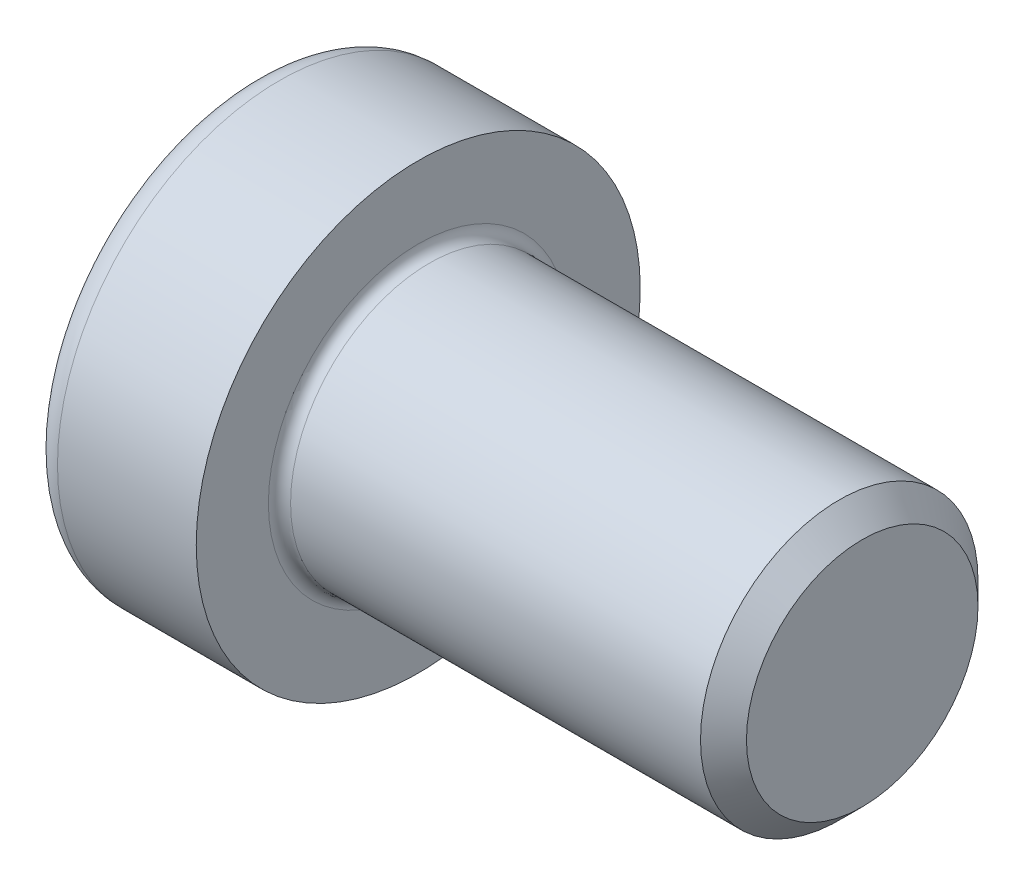
ISO-10303-21;
HEADER;
FILE_DESCRIPTION(('STEP AP214'),'2;1');
FILE_NAME('part.step','',(''),(''),'','','');
FILE_SCHEMA(('AUTOMOTIVE_DESIGN { 1 0 10303 214 1 1 1 1 }'));
ENDSEC;
DATA;
#1=APPLICATION_CONTEXT('core data for automotive mechanical design processes');
#2=APPLICATION_PROTOCOL_DEFINITION('international standard','automotive_design',2000,#1);
#3=PRODUCT_CONTEXT('',#1,'mechanical');
#4=PRODUCT('Part','Part','',(#3));
#5=PRODUCT_RELATED_PRODUCT_CATEGORY('part','',(#4));
#6=PRODUCT_DEFINITION_FORMATION('','',#4);
#7=PRODUCT_DEFINITION_CONTEXT('part definition',#1,'design');
#8=PRODUCT_DEFINITION('design','',#6,#7);
#9=PRODUCT_DEFINITION_SHAPE('','',#8);
#10=(LENGTH_UNIT() NAMED_UNIT(*) SI_UNIT(.MILLI.,.METRE.));
#11=(NAMED_UNIT(*) PLANE_ANGLE_UNIT() SI_UNIT($,.RADIAN.));
#12=(NAMED_UNIT(*) SI_UNIT($,.STERADIAN.) SOLID_ANGLE_UNIT());
#13=UNCERTAINTY_MEASURE_WITH_UNIT(LENGTH_MEASURE(1.E-05),#10,'distance_accuracy_value','');
#14=(GEOMETRIC_REPRESENTATION_CONTEXT(3) GLOBAL_UNCERTAINTY_ASSIGNED_CONTEXT((#13)) GLOBAL_UNIT_ASSIGNED_CONTEXT((#10,
#11,#12)) REPRESENTATION_CONTEXT('',''));
#15=CARTESIAN_POINT('',(0.,0.,0.));
#16=DIRECTION('',(0.,0.,1.));
#17=DIRECTION('',(1.,0.,0.));
#18=AXIS2_PLACEMENT_3D('',#15,#16,#17);
#19=CARTESIAN_POINT('',(0.,0.,0.));
#20=DIRECTION('',(-1.,0.,0.));
#21=DIRECTION('',(0.,0.,1.));
#22=AXIS2_PLACEMENT_3D('',#19,#20,#21);
#23=PLANE('',#22);
#24=DIRECTION('',(0.,-0.499999999999997,0.86602540378444));
#25=VECTOR('',#24,1.);
#26=CARTESIAN_POINT('',(0.,4.04145188432738,0.));
#27=LINE('',#26,#25);
#28=CARTESIAN_POINT('',(0.,4.04145188432738,0.));
#29=VERTEX_POINT('',#28);
#30=CARTESIAN_POINT('',(0.,2.0207259421637,3.49999999999999));
#31=VERTEX_POINT('',#30);
#32=EDGE_CURVE('E305',#29,#31,#27,.T.);
#33=ORIENTED_EDGE('',*,*,#32,.T.);
#34=DIRECTION('',(0.,1.,0.));
#35=VECTOR('',#34,1.);
#36=CARTESIAN_POINT('',(0.,-2.02072594216367,3.5));
#37=LINE('',#36,#35);
#38=CARTESIAN_POINT('',(0.,-2.02072594216367,3.5));
#39=VERTEX_POINT('',#38);
#40=EDGE_CURVE('E146',#39,#31,#37,.T.);
#41=ORIENTED_EDGE('',*,*,#40,.F.);
#42=DIRECTION('',(0.,-0.500000000000001,-0.866025403784438));
#43=VECTOR('',#42,1.);
#44=CARTESIAN_POINT('',(0.,-2.02072594216367,3.5));
#45=LINE('',#44,#43);
#46=CARTESIAN_POINT('',(0.,-4.04145188432737,0.));
#47=VERTEX_POINT('',#46);
#48=EDGE_CURVE('E310',#39,#47,#45,.T.);
#49=ORIENTED_EDGE('',*,*,#48,.T.);
#50=DIRECTION('',(0.,0.499999999999997,-0.86602540378444));
#51=VECTOR('',#50,1.);
#52=CARTESIAN_POINT('',(0.,-4.04145188432737,0.));
#53=LINE('',#52,#51);
#54=CARTESIAN_POINT('',(0.,-2.02072594216369,-3.5));
#55=VERTEX_POINT('',#54);
#56=EDGE_CURVE('E314',#47,#55,#53,.T.);
#57=ORIENTED_EDGE('',*,*,#56,.T.);
#58=DIRECTION('',(0.,-1.,0.));
#59=VECTOR('',#58,1.);
#60=CARTESIAN_POINT('',(0.,2.02072594216369,-3.50000000000001));
#61=LINE('',#60,#59);
#62=CARTESIAN_POINT('',(0.,2.02072594216369,-3.50000000000001));
#63=VERTEX_POINT('',#62);
#64=EDGE_CURVE('E318',#63,#55,#61,.T.);
#65=ORIENTED_EDGE('',*,*,#64,.F.);
#66=DIRECTION('',(0.,-0.500000000000001,-0.866025403784438));
#67=VECTOR('',#66,1.);
#68=CARTESIAN_POINT('',(0.,4.04145188432738,0.));
#69=LINE('',#68,#67);
#70=EDGE_CURVE('E141',#29,#63,#69,.T.);
#71=ORIENTED_EDGE('',*,*,#70,.F.);
#72=EDGE_LOOP('',(#33,#41,#49,#57,#65,#71));
#73=FACE_BOUND('',#72,.T.);
#74=CARTESIAN_POINT('',(0.,0.,0.));
#75=DIRECTION('',(-1.,0.,0.));
#76=DIRECTION('',(0.,0.,1.));
#77=AXIS2_PLACEMENT_3D('',#74,#75,#76);
#78=CIRCLE('',#77,7.);
#79=CARTESIAN_POINT('',(0.,0.,7.));
#80=VERTEX_POINT('',#79);
#81=EDGE_CURVE('E60',#80,#80,#78,.T.);
#82=ORIENTED_EDGE('',*,*,#81,.T.);
#83=EDGE_LOOP('',(#82));
#84=FACE_BOUND('',#83,.T.);
#85=ADVANCED_FACE('F51',(#73,#84),#23,.T.);
#86=CARTESIAN_POINT('',(-31.75,0.,0.));
#87=DIRECTION('',(-1.,0.,0.));
#88=DIRECTION('',(0.,0.,1.));
#89=AXIS2_PLACEMENT_3D('',#86,#87,#88);
#90=CYLINDRICAL_SURFACE('',#89,8.);
#91=CARTESIAN_POINT('',(1.,0.,0.));
#92=DIRECTION('',(-1.,0.,0.));
#93=DIRECTION('',(0.,0.,1.));
#94=AXIS2_PLACEMENT_3D('',#91,#92,#93);
#95=CIRCLE('',#94,8.);
#96=CARTESIAN_POINT('',(1.,0.,8.));
#97=VERTEX_POINT('',#96);
#98=EDGE_CURVE('E11',#97,#97,#95,.F.);
#99=ORIENTED_EDGE('',*,*,#98,.T.);
#100=EDGE_LOOP('',(#99));
#101=FACE_BOUND('',#100,.T.);
#102=CARTESIAN_POINT('',(6.,0.,0.));
#103=DIRECTION('',(-1.,0.,0.));
#104=DIRECTION('',(0.,0.,1.));
#105=AXIS2_PLACEMENT_3D('',#102,#103,#104);
#106=CIRCLE('',#105,8.);
#107=CARTESIAN_POINT('',(6.,0.,8.));
#108=VERTEX_POINT('',#107);
#109=EDGE_CURVE('E171',#108,#108,#106,.T.);
#110=ORIENTED_EDGE('',*,*,#109,.T.);
#111=EDGE_LOOP('',(#110));
#112=FACE_BOUND('',#111,.T.);
#113=ADVANCED_FACE('F200',(#101,#112),#90,.T.);
#114=CARTESIAN_POINT('',(6.,8.,0.));
#115=DIRECTION('',(1.,0.,0.));
#116=DIRECTION('',(0.,0.,-1.));
#117=AXIS2_PLACEMENT_3D('',#114,#115,#116);
#118=PLANE('',#117);
#119=CARTESIAN_POINT('',(6.,0.,0.));
#120=DIRECTION('',(1.,0.,0.));
#121=DIRECTION('',(0.,0.,-1.));
#122=AXIS2_PLACEMENT_3D('',#119,#120,#121);
#123=CIRCLE('',#122,5.39999999999996);
#124=CARTESIAN_POINT('',(6.,0.,-5.39999999999996));
#125=VERTEX_POINT('',#124);
#126=EDGE_CURVE('E175',#125,#125,#123,.F.);
#127=ORIENTED_EDGE('',*,*,#126,.T.);
#128=EDGE_LOOP('',(#127));
#129=FACE_BOUND('',#128,.T.);
#130=ORIENTED_EDGE('',*,*,#109,.F.);
#131=EDGE_LOOP('',(#130));
#132=FACE_BOUND('',#131,.T.);
#133=ADVANCED_FACE('F206',(#129,#132),#118,.T.);
#134=CARTESIAN_POINT('',(-31.75,0.,0.));
#135=DIRECTION('',(-1.,0.,0.));
#136=DIRECTION('',(0.,0.,1.));
#137=AXIS2_PLACEMENT_3D('',#134,#135,#136);
#138=CYLINDRICAL_SURFACE('',#137,4.99999999999996);
#139=CARTESIAN_POINT('',(6.4,0.,0.));
#140=DIRECTION('',(1.,0.,0.));
#141=DIRECTION('',(0.,0.,-1.));
#142=AXIS2_PLACEMENT_3D('',#139,#140,#141);
#143=CIRCLE('',#142,4.99999999999996);
#144=CARTESIAN_POINT('',(6.4,0.,-4.99999999999996));
#145=VERTEX_POINT('',#144);
#146=EDGE_CURVE('E179',#145,#145,#143,.T.);
#147=ORIENTED_EDGE('',*,*,#146,.T.);
#148=EDGE_LOOP('',(#147));
#149=FACE_BOUND('',#148,.T.);
#150=CARTESIAN_POINT('',(21.1719999999999,0.,0.));
#151=DIRECTION('',(-1.,0.,0.));
#152=DIRECTION('',(0.,0.,1.));
#153=AXIS2_PLACEMENT_3D('',#150,#151,#152);
#154=CIRCLE('',#153,4.99999999999992);
#155=CARTESIAN_POINT('',(21.1719999999999,0.,4.99999999999992));
#156=VERTEX_POINT('',#155);
#157=EDGE_CURVE('E167',#156,#156,#154,.T.);
#158=ORIENTED_EDGE('',*,*,#157,.T.);
#159=EDGE_LOOP('',(#158));
#160=FACE_BOUND('',#159,.T.);
#161=ADVANCED_FACE('F212',(#149,#160),#138,.T.);
#162=CARTESIAN_POINT('',(22.,0.,0.));
#163=DIRECTION('',(-1.,0.,0.));
#164=DIRECTION('',(0.,0.,1.));
#165=AXIS2_PLACEMENT_3D('',#162,#163,#164);
#166=CONICAL_SURFACE('',#165,4.172,0.785398163397357);
#167=ORIENTED_EDGE('',*,*,#157,.F.);
#168=EDGE_LOOP('',(#167));
#169=FACE_BOUND('',#168,.T.);
#170=CARTESIAN_POINT('',(22.,0.,0.));
#171=DIRECTION('',(-1.,0.,0.));
#172=DIRECTION('',(0.,0.,1.));
#173=AXIS2_PLACEMENT_3D('',#170,#171,#172);
#174=CIRCLE('',#173,4.172);
#175=CARTESIAN_POINT('',(22.,0.,4.172));
#176=VERTEX_POINT('',#175);
#177=EDGE_CURVE('E162',#176,#176,#174,.T.);
#178=ORIENTED_EDGE('',*,*,#177,.T.);
#179=EDGE_LOOP('',(#178));
#180=FACE_BOUND('',#179,.T.);
#181=ADVANCED_FACE('F216',(#169,#180),#166,.T.);
#182=CARTESIAN_POINT('',(22.,4.172,0.));
#183=DIRECTION('',(1.,0.,0.));
#184=DIRECTION('',(0.,0.,-1.));
#185=AXIS2_PLACEMENT_3D('',#182,#183,#184);
#186=PLANE('',#185);
#187=ORIENTED_EDGE('',*,*,#177,.F.);
#188=EDGE_LOOP('',(#187));
#189=FACE_BOUND('',#188,.T.);
#190=ADVANCED_FACE('F196',(#189),#186,.T.);
#191=CARTESIAN_POINT('',(6.4,0.,0.));
#192=DIRECTION('',(1.,0.,0.));
#193=DIRECTION('',(0.,0.,-1.));
#194=AXIS2_PLACEMENT_3D('',#191,#192,#193);
#195=TOROIDAL_SURFACE('',#194,5.39999999999996,0.4);
#196=ORIENTED_EDGE('',*,*,#146,.F.);
#197=EDGE_LOOP('',(#196));
#198=FACE_BOUND('',#197,.T.);
#199=ORIENTED_EDGE('',*,*,#126,.F.);
#200=EDGE_LOOP('',(#199));
#201=FACE_BOUND('',#200,.T.);
#202=ADVANCED_FACE('F189',(#198,#201),#195,.F.);
#203=CARTESIAN_POINT('',(1.,0.,0.));
#204=DIRECTION('',(-1.,0.,0.));
#205=DIRECTION('',(0.,0.,1.));
#206=AXIS2_PLACEMENT_3D('',#203,#204,#205);
#207=TOROIDAL_SURFACE('',#206,7.,1.);
#208=ORIENTED_EDGE('',*,*,#98,.F.);
#209=EDGE_LOOP('',(#208));
#210=FACE_BOUND('',#209,.T.);
#211=ORIENTED_EDGE('',*,*,#81,.F.);
#212=EDGE_LOOP('',(#211));
#213=FACE_BOUND('',#212,.T.);
#214=ADVANCED_FACE('F53',(#210,#213),#207,.T.);
#215=CARTESIAN_POINT('',(4.5,4.04145188432738,0.));
#216=DIRECTION('',(0.,-0.86602540378444,-0.499999999999997));
#217=DIRECTION('',(0.,0.499999999999997,-0.86602540378444));
#218=AXIS2_PLACEMENT_3D('',#215,#216,#217);
#219=PLANE('',#218);
#220=ORIENTED_EDGE('',*,*,#32,.F.);
#221=DIRECTION('',(-1.,0.,0.));
#222=VECTOR('',#221,1.);
#223=CARTESIAN_POINT('',(4.5,4.04145188432738,0.));
#224=LINE('',#223,#222);
#225=CARTESIAN_POINT('',(4.5,4.04145188432738,0.));
#226=VERTEX_POINT('',#225);
#227=EDGE_CURVE('E304',#226,#29,#224,.T.);
#228=ORIENTED_EDGE('',*,*,#227,.F.);
#229=DIRECTION('',(0.,-0.499999999999997,0.86602540378444));
#230=VECTOR('',#229,1.);
#231=CARTESIAN_POINT('',(4.5,4.04145188432738,0.));
#232=LINE('',#231,#230);
#233=CARTESIAN_POINT('',(4.5,3.03108891324554,1.74999999999999));
#234=VERTEX_POINT('',#233);
#235=EDGE_CURVE('E67',#226,#234,#232,.T.);
#236=ORIENTED_EDGE('',*,*,#235,.T.);
#237=CARTESIAN_POINT('',(4.5,2.0207259421637,3.49999999999999));
#238=VERTEX_POINT('',#237);
#239=EDGE_CURVE('E125',#234,#238,#232,.T.);
#240=ORIENTED_EDGE('',*,*,#239,.T.);
#241=DIRECTION('',(-1.,0.,0.));
#242=VECTOR('',#241,1.);
#243=CARTESIAN_POINT('',(4.5,2.0207259421637,3.49999999999999));
#244=LINE('',#243,#242);
#245=EDGE_CURVE('E138',#238,#31,#244,.T.);
#246=ORIENTED_EDGE('',*,*,#245,.T.);
#247=EDGE_LOOP('',(#220,#228,#236,#240,#246));
#248=FACE_BOUND('',#247,.T.);
#249=ADVANCED_FACE('F137',(#248),#219,.T.);
#250=CARTESIAN_POINT('',(4.5,-2.02072594216367,3.5));
#251=DIRECTION('',(0.,0.,1.));
#252=DIRECTION('',(0.,-1.,0.));
#253=AXIS2_PLACEMENT_3D('',#250,#251,#252);
#254=PLANE('',#253);
#255=ORIENTED_EDGE('',*,*,#40,.T.);
#256=ORIENTED_EDGE('',*,*,#245,.F.);
#257=DIRECTION('',(0.,1.,0.));
#258=VECTOR('',#257,1.);
#259=CARTESIAN_POINT('',(4.5,-2.02072594216367,3.5));
#260=LINE('',#259,#258);
#261=CARTESIAN_POINT('',(4.5,0.,3.49999999999999));
#262=VERTEX_POINT('',#261);
#263=EDGE_CURVE('E123',#262,#238,#260,.T.);
#264=ORIENTED_EDGE('',*,*,#263,.F.);
#265=CARTESIAN_POINT('',(4.5,-2.02072594216367,3.5));
#266=VERTEX_POINT('',#265);
#267=EDGE_CURVE('E134',#266,#262,#260,.T.);
#268=ORIENTED_EDGE('',*,*,#267,.F.);
#269=DIRECTION('',(-1.,0.,0.));
#270=VECTOR('',#269,1.);
#271=CARTESIAN_POINT('',(4.5,-2.02072594216367,3.5));
#272=LINE('',#271,#270);
#273=EDGE_CURVE('E149',#266,#39,#272,.T.);
#274=ORIENTED_EDGE('',*,*,#273,.T.);
#275=EDGE_LOOP('',(#255,#256,#264,#268,#274));
#276=FACE_BOUND('',#275,.T.);
#277=ADVANCED_FACE('F143',(#276),#254,.F.);
#278=CARTESIAN_POINT('',(4.5,-2.02072594216367,3.5));
#279=DIRECTION('',(0.,0.866025403784438,-0.500000000000001));
#280=DIRECTION('',(0.,0.500000000000001,0.866025403784438));
#281=AXIS2_PLACEMENT_3D('',#278,#279,#280);
#282=PLANE('',#281);
#283=ORIENTED_EDGE('',*,*,#48,.F.);
#284=ORIENTED_EDGE('',*,*,#273,.F.);
#285=DIRECTION('',(0.,-0.500000000000001,-0.866025403784438));
#286=VECTOR('',#285,1.);
#287=CARTESIAN_POINT('',(4.5,-2.02072594216367,3.5));
#288=LINE('',#287,#286);
#289=CARTESIAN_POINT('',(4.5,-3.03108891324552,1.75));
#290=VERTEX_POINT('',#289);
#291=EDGE_CURVE('E278',#266,#290,#288,.T.);
#292=ORIENTED_EDGE('',*,*,#291,.T.);
#293=CARTESIAN_POINT('',(4.5,-4.04145188432737,0.));
#294=VERTEX_POINT('',#293);
#295=EDGE_CURVE('E280',#290,#294,#288,.T.);
#296=ORIENTED_EDGE('',*,*,#295,.T.);
#297=DIRECTION('',(-1.,0.,0.));
#298=VECTOR('',#297,1.);
#299=CARTESIAN_POINT('',(4.5,-4.04145188432737,0.));
#300=LINE('',#299,#298);
#301=EDGE_CURVE('E157',#294,#47,#300,.T.);
#302=ORIENTED_EDGE('',*,*,#301,.T.);
#303=EDGE_LOOP('',(#283,#284,#292,#296,#302));
#304=FACE_BOUND('',#303,.T.);
#305=ADVANCED_FACE('F229',(#304),#282,.T.);
#306=CARTESIAN_POINT('',(4.5,-4.04145188432737,0.));
#307=DIRECTION('',(0.,0.86602540378444,0.499999999999997));
#308=DIRECTION('',(0.,-0.499999999999998,0.86602540378444));
#309=AXIS2_PLACEMENT_3D('',#306,#307,#308);
#310=PLANE('',#309);
#311=ORIENTED_EDGE('',*,*,#56,.F.);
#312=ORIENTED_EDGE('',*,*,#301,.F.);
#313=DIRECTION('',(0.,0.499999999999997,-0.86602540378444));
#314=VECTOR('',#313,1.);
#315=CARTESIAN_POINT('',(4.5,-4.04145188432737,0.));
#316=LINE('',#315,#314);
#317=CARTESIAN_POINT('',(4.5,-3.03108891324554,-1.74999999999999));
#318=VERTEX_POINT('',#317);
#319=EDGE_CURVE('E283',#294,#318,#316,.T.);
#320=ORIENTED_EDGE('',*,*,#319,.T.);
#321=CARTESIAN_POINT('',(4.5,-2.02072594216369,-3.5));
#322=VERTEX_POINT('',#321);
#323=EDGE_CURVE('E289',#318,#322,#316,.T.);
#324=ORIENTED_EDGE('',*,*,#323,.T.);
#325=DIRECTION('',(-1.,0.,0.));
#326=VECTOR('',#325,1.);
#327=CARTESIAN_POINT('',(4.5,-2.02072594216369,-3.5));
#328=LINE('',#327,#326);
#329=EDGE_CURVE('E331',#322,#55,#328,.T.);
#330=ORIENTED_EDGE('',*,*,#329,.T.);
#331=EDGE_LOOP('',(#311,#312,#320,#324,#330));
#332=FACE_BOUND('',#331,.T.);
#333=ADVANCED_FACE('F232',(#332),#310,.T.);
#334=CARTESIAN_POINT('',(4.5,2.02072594216369,-3.50000000000001));
#335=DIRECTION('',(0.,0.,-1.));
#336=DIRECTION('',(0.,1.,0.));
#337=AXIS2_PLACEMENT_3D('',#334,#335,#336);
#338=PLANE('',#337);
#339=ORIENTED_EDGE('',*,*,#64,.T.);
#340=ORIENTED_EDGE('',*,*,#329,.F.);
#341=DIRECTION('',(0.,-1.,0.));
#342=VECTOR('',#341,1.);
#343=CARTESIAN_POINT('',(4.5,2.02072594216369,-3.50000000000001));
#344=LINE('',#343,#342);
#345=CARTESIAN_POINT('',(4.5,0.,-3.5));
#346=VERTEX_POINT('',#345);
#347=EDGE_CURVE('E296',#346,#322,#344,.T.);
#348=ORIENTED_EDGE('',*,*,#347,.F.);
#349=CARTESIAN_POINT('',(4.5,2.02072594216369,-3.50000000000001));
#350=VERTEX_POINT('',#349);
#351=EDGE_CURVE('E297',#350,#346,#344,.T.);
#352=ORIENTED_EDGE('',*,*,#351,.F.);
#353=DIRECTION('',(-1.,0.,0.));
#354=VECTOR('',#353,1.);
#355=CARTESIAN_POINT('',(4.5,2.02072594216369,-3.50000000000001));
#356=LINE('',#355,#354);
#357=EDGE_CURVE('E327',#350,#63,#356,.T.);
#358=ORIENTED_EDGE('',*,*,#357,.T.);
#359=EDGE_LOOP('',(#339,#340,#348,#352,#358));
#360=FACE_BOUND('',#359,.T.);
#361=ADVANCED_FACE('F236',(#360),#338,.F.);
#362=CARTESIAN_POINT('',(4.5,4.04145188432738,0.));
#363=DIRECTION('',(0.,0.866025403784438,-0.500000000000001));
#364=DIRECTION('',(0.,0.500000000000001,0.866025403784438));
#365=AXIS2_PLACEMENT_3D('',#362,#363,#364);
#366=PLANE('',#365);
#367=ORIENTED_EDGE('',*,*,#70,.T.);
#368=ORIENTED_EDGE('',*,*,#357,.F.);
#369=DIRECTION('',(0.,-0.500000000000001,-0.866025403784438));
#370=VECTOR('',#369,1.);
#371=CARTESIAN_POINT('',(4.5,4.04145188432738,0.));
#372=LINE('',#371,#370);
#373=CARTESIAN_POINT('',(4.5,3.03108891324554,-1.75000000000001));
#374=VERTEX_POINT('',#373);
#375=EDGE_CURVE('E301',#374,#350,#372,.T.);
#376=ORIENTED_EDGE('',*,*,#375,.F.);
#377=EDGE_CURVE('E268',#226,#374,#372,.T.);
#378=ORIENTED_EDGE('',*,*,#377,.F.);
#379=ORIENTED_EDGE('',*,*,#227,.T.);
#380=EDGE_LOOP('',(#367,#368,#376,#378,#379));
#381=FACE_BOUND('',#380,.T.);
#382=ADVANCED_FACE('F240',(#381),#366,.F.);
#383=CARTESIAN_POINT('',(4.5,2.0207259421637,3.49999999999999));
#384=DIRECTION('',(-1.,0.,0.));
#385=DIRECTION('',(0.,0.,1.));
#386=AXIS2_PLACEMENT_3D('',#383,#384,#385);
#387=PLANE('',#386);
#388=CARTESIAN_POINT('',(4.5,0.,0.));
#389=DIRECTION('',(-1.,0.,0.));
#390=DIRECTION('',(0.,0.,1.));
#391=AXIS2_PLACEMENT_3D('',#388,#389,#390);
#392=CIRCLE('',#391,3.5);
#393=EDGE_CURVE('E148',#290,#262,#392,.T.);
#394=ORIENTED_EDGE('',*,*,#393,.F.);
#395=ORIENTED_EDGE('',*,*,#291,.F.);
#396=ORIENTED_EDGE('',*,*,#267,.T.);
#397=EDGE_LOOP('',(#394,#395,#396));
#398=FACE_BOUND('',#397,.T.);
#399=ADVANCED_FACE('F244',(#398),#387,.T.);
#400=EDGE_CURVE('E155',#318,#290,#392,.T.);
#401=ORIENTED_EDGE('',*,*,#400,.F.);
#402=ORIENTED_EDGE('',*,*,#319,.F.);
#403=ORIENTED_EDGE('',*,*,#295,.F.);
#404=EDGE_LOOP('',(#401,#402,#403));
#405=FACE_BOUND('',#404,.T.);
#406=ADVANCED_FACE('F247',(#405),#387,.T.);
#407=EDGE_CURVE('E350',#346,#318,#392,.T.);
#408=ORIENTED_EDGE('',*,*,#407,.F.);
#409=ORIENTED_EDGE('',*,*,#347,.T.);
#410=ORIENTED_EDGE('',*,*,#323,.F.);
#411=EDGE_LOOP('',(#408,#409,#410));
#412=FACE_BOUND('',#411,.T.);
#413=ADVANCED_FACE('F252',(#412),#387,.T.);
#414=EDGE_CURVE('E272',#374,#346,#392,.T.);
#415=ORIENTED_EDGE('',*,*,#414,.F.);
#416=ORIENTED_EDGE('',*,*,#375,.T.);
#417=ORIENTED_EDGE('',*,*,#351,.T.);
#418=EDGE_LOOP('',(#415,#416,#417));
#419=FACE_BOUND('',#418,.T.);
#420=ADVANCED_FACE('F259',(#419),#387,.T.);
#421=EDGE_CURVE('E163',#234,#374,#392,.T.);
#422=ORIENTED_EDGE('',*,*,#421,.F.);
#423=ORIENTED_EDGE('',*,*,#235,.F.);
#424=ORIENTED_EDGE('',*,*,#377,.T.);
#425=EDGE_LOOP('',(#422,#423,#424));
#426=FACE_BOUND('',#425,.T.);
#427=ADVANCED_FACE('F255',(#426),#387,.T.);
#428=EDGE_CURVE('E128',#262,#234,#392,.T.);
#429=ORIENTED_EDGE('',*,*,#428,.F.);
#430=ORIENTED_EDGE('',*,*,#263,.T.);
#431=ORIENTED_EDGE('',*,*,#239,.F.);
#432=EDGE_LOOP('',(#429,#430,#431));
#433=FACE_BOUND('',#432,.T.);
#434=ADVANCED_FACE('F124',(#433),#387,.T.);
#435=CARTESIAN_POINT('',(4.5,0.,0.));
#436=DIRECTION('',(-1.,0.,0.));
#437=DIRECTION('',(0.,0.,1.));
#438=AXIS2_PLACEMENT_3D('',#435,#436,#437);
#439=CONICAL_SURFACE('',#438,3.5,1.04719755119659);
#440=CARTESIAN_POINT('',(6.52072594216371,0.,0.));
#441=VERTEX_POINT('',#440);
#442=VERTEX_LOOP('',#441);
#443=FACE_BOUND('',#442,.T.);
#444=ORIENTED_EDGE('',*,*,#428,.T.);
#445=ORIENTED_EDGE('',*,*,#421,.T.);
#446=ORIENTED_EDGE('',*,*,#414,.T.);
#447=ORIENTED_EDGE('',*,*,#407,.T.);
#448=ORIENTED_EDGE('',*,*,#400,.T.);
#449=ORIENTED_EDGE('',*,*,#393,.T.);
#450=EDGE_LOOP('',(#444,#445,#446,#447,#448,#449));
#451=FACE_BOUND('',#450,.T.);
#452=ADVANCED_FACE('F224',(#443,#451),#439,.F.);
#453=CLOSED_SHELL('',(#85,#113,#133,#161,#181,#190,#202,#214,#249,#277,#305,#333,#361,#382,#399,
#406,#413,#420,#427,#434,#452));
#454=MANIFOLD_SOLID_BREP('B2',#453);
#455=ADVANCED_BREP_SHAPE_REPRESENTATION('',(#18,#454),#14);
#456=SHAPE_DEFINITION_REPRESENTATION(#9,#455);
ENDSEC;
END-ISO-10303-21;
